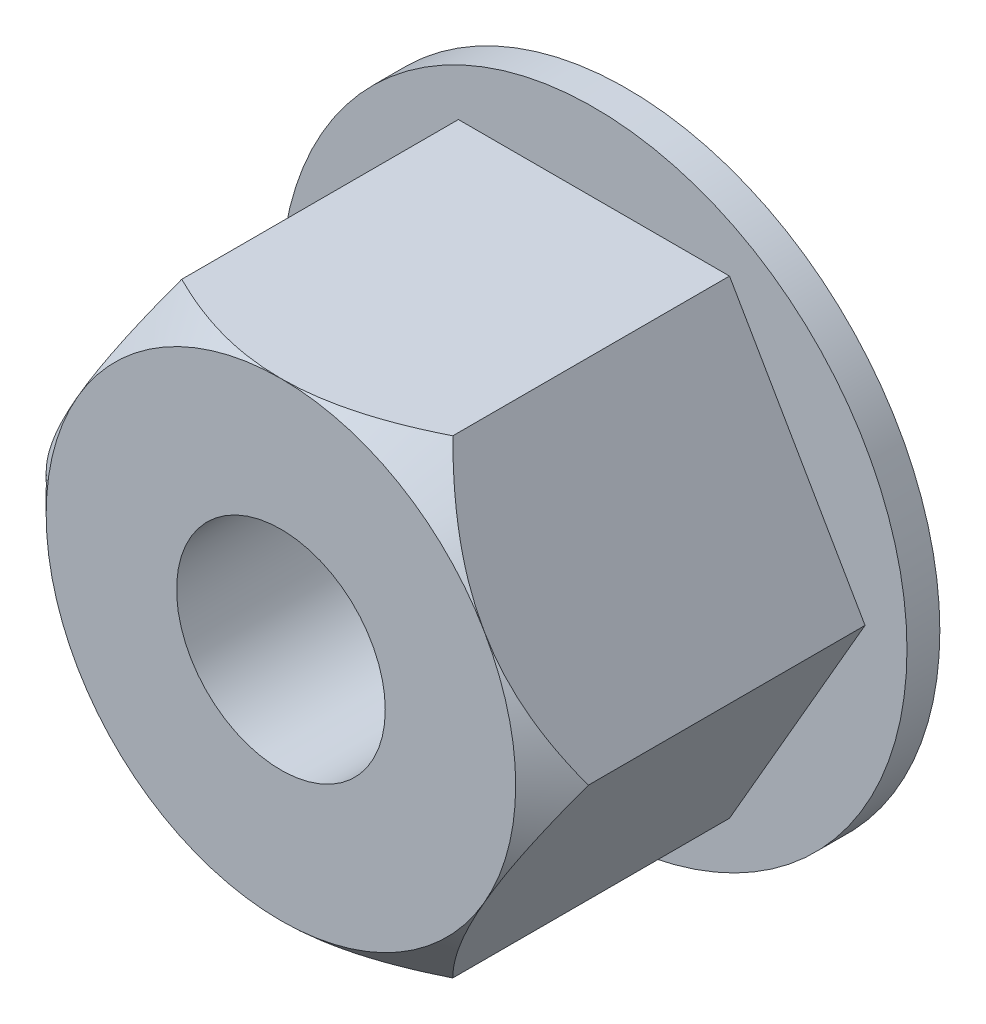
ISO-10303-21;
HEADER;
FILE_DESCRIPTION(('STEP AP214'),'2;1');
FILE_NAME('part.step','',(''),(''),'','','');
FILE_SCHEMA(('AUTOMOTIVE_DESIGN { 1 0 10303 214 1 1 1 1 }'));
ENDSEC;
DATA;
#1=APPLICATION_CONTEXT('core data for automotive mechanical design processes');
#2=APPLICATION_PROTOCOL_DEFINITION('international standard','automotive_design',2000,#1);
#3=PRODUCT_CONTEXT('',#1,'mechanical');
#4=PRODUCT('Part','Part','',(#3));
#5=PRODUCT_RELATED_PRODUCT_CATEGORY('part','',(#4));
#6=PRODUCT_DEFINITION_FORMATION('','',#4);
#7=PRODUCT_DEFINITION_CONTEXT('part definition',#1,'design');
#8=PRODUCT_DEFINITION('design','',#6,#7);
#9=PRODUCT_DEFINITION_SHAPE('','',#8);
#10=(LENGTH_UNIT() NAMED_UNIT(*) SI_UNIT(.MILLI.,.METRE.));
#11=(NAMED_UNIT(*) PLANE_ANGLE_UNIT() SI_UNIT($,.RADIAN.));
#12=(NAMED_UNIT(*) SI_UNIT($,.STERADIAN.) SOLID_ANGLE_UNIT());
#13=UNCERTAINTY_MEASURE_WITH_UNIT(LENGTH_MEASURE(1.E-05),#10,'distance_accuracy_value','');
#14=(GEOMETRIC_REPRESENTATION_CONTEXT(3) GLOBAL_UNCERTAINTY_ASSIGNED_CONTEXT((#13)) GLOBAL_UNIT_ASSIGNED_CONTEXT((#10,
#11,#12)) REPRESENTATION_CONTEXT('',''));
#15=CARTESIAN_POINT('',(0.,0.,0.));
#16=DIRECTION('',(0.,0.,1.));
#17=DIRECTION('',(1.,0.,0.));
#18=AXIS2_PLACEMENT_3D('',#15,#16,#17);
#19=CARTESIAN_POINT('',(-4.1244459855234,-7.14375000000002,10.525));
#20=DIRECTION('',(0.,1.,0.));
#21=DIRECTION('',(-1.,0.,0.));
#22=AXIS2_PLACEMENT_3D('',#19,#20,#21);
#23=PLANE('',#22);
#24=CARTESIAN_POINT('',(-16.7250366044685,-7.14375000000002,-0.518058776784079));
#25=CARTESIAN_POINT('',(-16.4772606232411,-7.14375000000002,-0.290202068247929));
#26=CARTESIAN_POINT('',(-16.2291000095933,-7.14375000000002,-0.0627636921610241));
#27=CARTESIAN_POINT('',(-15.7318969190104,-7.14375000000002,0.391150865365517));
#28=CARTESIAN_POINT('',(-15.4828544351473,-7.14375000000002,0.61762703921507));
#29=CARTESIAN_POINT('',(-14.7341290902898,-7.14375000000002,1.29552003391436));
#30=CARTESIAN_POINT('',(-14.2329594945005,-7.14375000000002,1.74529889980172));
#31=CARTESIAN_POINT('',(-13.2223343051271,-7.14375000000002,2.64182451048178));
#32=CARTESIAN_POINT('',(-12.7128465921656,-7.14375000000002,3.08853512020836));
#33=CARTESIAN_POINT('',(-11.686949833058,-7.14375000000002,3.97383938239323));
#34=CARTESIAN_POINT('',(-11.1705416291098,-7.14375000000002,4.41243400734457));
#35=CARTESIAN_POINT('',(-10.2225431256704,-7.14375000000002,5.19970914844742));
#36=CARTESIAN_POINT('',(-9.79253441656831,-7.14375000000002,5.55028481134301));
#37=CARTESIAN_POINT('',(-9.14103972049585,-7.14375000000002,6.06812401606699));
#38=CARTESIAN_POINT('',(-8.92276245081286,-7.14375000000002,6.23942394288043));
#39=CARTESIAN_POINT('',(-8.48371410990984,-7.14375000000002,6.57879359718683));
#40=CARTESIAN_POINT('',(-8.26294309628304,-7.14375000000002,6.74686339903862));
#41=CARTESIAN_POINT('',(-7.81873153558713,-7.14375000000002,7.07894407832289));
#42=CARTESIAN_POINT('',(-7.59529409899517,-7.14375000000002,7.24295910793026));
#43=CARTESIAN_POINT('',(-7.14503666060728,-7.14375000000002,7.56626753184713));
#44=CARTESIAN_POINT('',(-6.91821683000169,-7.14375000000002,7.72556116390589));
#45=CARTESIAN_POINT('',(-6.46069077173736,-7.14375000000002,8.03828754489159));
#46=CARTESIAN_POINT('',(-6.22998612554177,-7.14375000000002,8.19172259945192));
#47=CARTESIAN_POINT('',(-5.76394688788904,-7.14375000000002,8.4913654457624));
#48=CARTESIAN_POINT('',(-5.52861284405243,-7.14375000000002,8.63757408523746));
#49=CARTESIAN_POINT('',(-5.05473585230229,-7.14375000000002,8.91960187726864));
#50=CARTESIAN_POINT('',(-4.81624328739911,-7.14375000000002,9.0555051944565));
#51=CARTESIAN_POINT('',(-4.3331026551001,-7.14375000000002,9.31605282098714));
#52=CARTESIAN_POINT('',(-4.08845393418546,-7.14375000000002,9.44069592847851));
#53=CARTESIAN_POINT('',(-3.59255053083213,-7.14375000000002,9.67550678093413));
#54=CARTESIAN_POINT('',(-3.34130293794439,-7.14375000000002,9.78568935500066));
#55=CARTESIAN_POINT('',(-2.83154865245522,-7.14375000000002,9.98785379074797));
#56=CARTESIAN_POINT('',(-2.57304408636675,-7.14375000000002,10.0798409219669));
#57=CARTESIAN_POINT('',(-2.10439267228609,-7.14375000000002,10.224087260101));
#58=CARTESIAN_POINT('',(-1.89557304749811,-7.14375000000002,10.2806340143584));
#59=CARTESIAN_POINT('',(-1.47415059126628,-7.14375000000002,10.3773668920018));
#60=CARTESIAN_POINT('',(-1.26154827286381,-7.14375000000002,10.4175552166682));
#61=CARTESIAN_POINT('',(-0.834260083156745,-7.14375000000002,10.4795476845427));
#62=CARTESIAN_POINT('',(-0.619581874776691,-7.14375000000002,10.5014038848691));
#63=CARTESIAN_POINT('',(-0.189118347484976,-7.14375000000002,10.5257274162521));
#64=CARTESIAN_POINT('',(0.0266669344548236,-7.14375000000002,10.5281953906348));
#65=CARTESIAN_POINT('',(0.45773915437624,-7.14375000000002,10.5135952718585));
#66=CARTESIAN_POINT('',(0.673025548824617,-7.14375000000002,10.4965113921098));
#67=CARTESIAN_POINT('',(1.10128730569013,-7.14375000000002,10.4437373997748));
#68=CARTESIAN_POINT('',(1.31426247020931,-7.14375000000002,10.4080457065367));
#69=CARTESIAN_POINT('',(1.73728850926878,-7.14375000000002,10.3197103179283));
#70=CARTESIAN_POINT('',(1.94732865034367,-7.14375000000002,10.2670159133343));
#71=CARTESIAN_POINT('',(2.3631100145607,-7.14375000000002,10.1469276162351));
#72=CARTESIAN_POINT('',(2.56885120657142,-7.14375000000002,10.0795336173213));
#73=CARTESIAN_POINT('',(3.01536837317726,-7.14375000000002,9.91799268441563));
#74=CARTESIAN_POINT('',(3.25517793101231,-7.14375000000002,9.82119186712124));
#75=CARTESIAN_POINT('',(3.72857594973338,-7.14375000000002,9.61330607400458));
#76=CARTESIAN_POINT('',(3.96216143791961,-7.14375000000002,9.50221441523576));
#77=CARTESIAN_POINT('',(4.42395812983921,-7.14375000000002,9.26846158223287));
#78=CARTESIAN_POINT('',(4.65215881551176,-7.14375000000002,9.14577978560599));
#79=CARTESIAN_POINT('',(5.10336871973889,-7.14375000000002,8.8913452550078));
#80=CARTESIAN_POINT('',(5.3263786829134,-7.14375000000002,8.75959383295891));
#81=CARTESIAN_POINT('',(5.77051838497509,-7.14375000000002,8.48719648844859));
#82=CARTESIAN_POINT('',(5.99159462760881,-7.14375000000002,8.34646374765074));
#83=CARTESIAN_POINT('',(6.42978238109183,-7.14375000000002,8.05896655456889));
#84=CARTESIAN_POINT('',(6.64689378801586,-7.14375000000002,7.91220194450585));
#85=CARTESIAN_POINT('',(7.07747046011472,-7.14375000000002,7.61391672475739));
#86=CARTESIAN_POINT('',(7.29093938413418,-7.14375000000002,7.46240138165555));
#87=CARTESIAN_POINT('',(7.71494702830292,-7.14375000000002,7.1553186177003));
#88=CARTESIAN_POINT('',(7.9254856343693,-7.14375000000002,6.99975103975892));
#89=CARTESIAN_POINT('',(8.52049459879557,-7.14375000000002,6.55268170187068));
#90=CARTESIAN_POINT('',(8.9019439207666,-7.14375000000002,6.25715983351294));
#91=CARTESIAN_POINT('',(9.65827357049301,-7.14375000000002,5.65782259108534));
#92=CARTESIAN_POINT('',(10.033153414996,-7.14375000000002,5.35400661106838));
#93=CARTESIAN_POINT('',(10.7780139721135,-7.14375000000002,4.73993293727246));
#94=CARTESIAN_POINT('',(11.1479912031739,-7.14375000000002,4.42967102948342));
#95=CARTESIAN_POINT('',(11.8838630594671,-7.14375000000002,3.80434271833466));
#96=CARTESIAN_POINT('',(12.2497576215634,-7.14375000000002,3.48927624085238));
#97=CARTESIAN_POINT('',(12.9615567346554,-7.14375000000002,2.86990501377884));
#98=CARTESIAN_POINT('',(13.3076085701216,-7.14375000000002,2.56576926669989));
#99=CARTESIAN_POINT('',(13.9972548315126,-7.14375000000002,1.95471884651708));
#100=CARTESIAN_POINT('',(14.3408492284557,-7.14375000000002,1.64780414073591));
#101=CARTESIAN_POINT('',(15.0255243163693,-7.14375000000002,1.03213086255791));
#102=CARTESIAN_POINT('',(15.3666078181235,-7.14375000000002,0.723375412676361));
#103=CARTESIAN_POINT('',(16.047041268799,-7.14375000000002,0.103981075888521));
#104=CARTESIAN_POINT('',(16.3863912722109,-7.14375000000002,-0.206657751136243));
#105=CARTESIAN_POINT('',(16.7250366044685,-7.14375000000002,-0.518058776784081));
#106=B_SPLINE_CURVE_WITH_KNOTS('',3,(#24,#25,#26,#27,#28,#29,#30,#31,#32,#33,#34,#35,#36,#37,
#38,#39,#40,#41,#42,#43,#44,#45,#46,#47,#48,#49,#50,#51,#52,#53,#54,#55,#56,#57,#58,#59,#60,#61,
#62,#63,#64,#65,#66,#67,#68,#69,#70,#71,#72,#73,#74,#75,#76,#77,#78,#79,#80,#81,#82,#83,#84,#85,
#86,#87,#88,#89,#90,#91,#92,#93,#94,#95,#96,#97,#98,#99,#100,#101,#102,#103,#104,#105),
.UNSPECIFIED.,.F.,.F.,(4,2,2,2,2,2,2,2,2,2,2,2,2,2,2,2,2,2,2,2,2,2,2,2,2,2,2,2,2,2,2,2,2,2,2,2,
2,2,2,2,4),(0.,1.00985278778081,2.01971352678839,4.03988845529254,6.07259935665231,
8.10506509147416,9.76934465015488,10.6017256936064,11.4340875522892,12.2655584352629,
13.0969873775597,13.9280856671059,14.7590862286508,15.5823381079753,16.4056777530121,
17.2281663636504,18.0504164254777,18.6988767508964,19.3472497870464,19.9937753660695,
20.6402794924568,21.2873059887437,21.9343874560389,22.5834169117916,23.2324510659489,
24.0076854473988,24.7832836851578,25.5602889171264,26.337181990413,27.1232703975962,
27.9093793800428,28.6946457323468,29.4799425715375,30.9273593771971,32.3748822120078,
33.8233831517974,35.2719064610067,36.654007954276,38.0361257206082,39.4163395084831,
40.7965096405426),.UNSPECIFIED.);
#107=CARTESIAN_POINT('',(-4.1244459855234,-7.14375000000002,9.41985802895322));
#108=VERTEX_POINT('',#107);
#109=CARTESIAN_POINT('',(0.,-7.14375000000002,10.525));
#110=VERTEX_POINT('',#109);
#111=EDGE_CURVE('E256',#108,#110,#106,.T.);
#112=ORIENTED_EDGE('',*,*,#111,.F.);
#113=DIRECTION('',(0.,0.,-1.));
#114=VECTOR('',#113,1.);
#115=CARTESIAN_POINT('',(-4.1244459855234,-7.14375000000002,10.525));
#116=LINE('',#115,#114);
#117=CARTESIAN_POINT('',(-4.1244459855234,-7.14375000000002,1.));
#118=VERTEX_POINT('',#117);
#119=EDGE_CURVE('E235',#108,#118,#116,.T.);
#120=ORIENTED_EDGE('',*,*,#119,.T.);
#121=DIRECTION('',(1.,0.,0.));
#122=VECTOR('',#121,1.);
#123=CARTESIAN_POINT('',(-4.1244459855234,-7.14375000000002,1.));
#124=LINE('',#123,#122);
#125=CARTESIAN_POINT('',(4.1244459855234,-7.14375000000002,1.));
#126=VERTEX_POINT('',#125);
#127=EDGE_CURVE('E251',#118,#126,#124,.T.);
#128=ORIENTED_EDGE('',*,*,#127,.T.);
#129=DIRECTION('',(0.,0.,-1.));
#130=VECTOR('',#129,1.);
#131=CARTESIAN_POINT('',(4.1244459855234,-7.14375000000002,10.525));
#132=LINE('',#131,#130);
#133=CARTESIAN_POINT('',(4.1244459855234,-7.14375000000002,9.41985802895322));
#134=VERTEX_POINT('',#133);
#135=EDGE_CURVE('E223',#134,#126,#132,.T.);
#136=ORIENTED_EDGE('',*,*,#135,.F.);
#137=EDGE_CURVE('E163',#110,#134,#106,.T.);
#138=ORIENTED_EDGE('',*,*,#137,.F.);
#139=EDGE_LOOP('',(#112,#120,#128,#136,#138));
#140=FACE_BOUND('',#139,.T.);
#141=ADVANCED_FACE('F34',(#140),#23,.F.);
#142=CARTESIAN_POINT('',(4.1244459855234,-7.14375000000002,10.525));
#143=DIRECTION('',(-0.866025403784439,0.5,0.));
#144=DIRECTION('',(-0.5,-0.866025403784439,0.));
#145=AXIS2_PLACEMENT_3D('',#142,#143,#144);
#146=PLANE('',#145);
#147=CARTESIAN_POINT('',(4.12433051546956,-7.14395000000002,9.41974255647485));
#148=CARTESIAN_POINT('',(4.19524703068089,-7.02111899255827,9.49065140521226));
#149=CARTESIAN_POINT('',(4.26670864124882,-6.89734385226391,9.55938414906155));
#150=CARTESIAN_POINT('',(4.41082898954811,-6.64772008660503,9.69183547302003));
#151=CARTESIAN_POINT('',(4.48348835526277,-6.5218703735415,9.75555131465574));
#152=CARTESIAN_POINT('',(4.70409848523477,-6.13976241976563,9.93872387688273));
#153=CARTESIAN_POINT('',(4.8539168024438,-5.88026948245511,10.0494242385606));
#154=CARTESIAN_POINT('',(5.15603740421412,-5.35698125017564,10.2389908902059));
#155=CARTESIAN_POINT('',(5.30826247233014,-5.09331969801306,10.3183347530669));
#156=CARTESIAN_POINT('',(5.5391026566828,-4.69349277028567,10.410116042587));
#157=CARTESIAN_POINT('',(5.61638923819207,-4.55962848436831,10.4361584480344));
#158=CARTESIAN_POINT('',(5.77161677972581,-4.29076649569787,10.4785757851785));
#159=CARTESIAN_POINT('',(5.84955764019293,-4.15576896538318,10.4949521615859));
#160=CARTESIAN_POINT('',(6.03948971703997,-3.82679695829702,10.5224096033269));
#161=CARTESIAN_POINT('',(6.15168557899214,-3.63246802499689,10.5281705840301));
#162=CARTESIAN_POINT('',(6.37587507682164,-3.24416042423284,10.5185003713287));
#163=CARTESIAN_POINT('',(6.48786862803521,-3.05018190341086,10.5030617493423));
#164=CARTESIAN_POINT('',(6.71079986264652,-2.66405367847001,10.45190237942));
#165=CARTESIAN_POINT('',(6.82173622400645,-2.4719062641878,10.4161589506573));
#166=CARTESIAN_POINT('',(7.04170221777466,-2.09091398704387,10.3263332014951));
#167=CARTESIAN_POINT('',(7.15073199571878,-1.90206887210671,10.2722522873392));
#168=CARTESIAN_POINT('',(7.34427751378539,-1.5668382012381,10.1609923795056));
#169=CARTESIAN_POINT('',(7.42922185909046,-1.41971027935405,10.106739720237));
#170=CARTESIAN_POINT('',(7.59758573237026,-1.12809549667434,9.98949193812102));
#171=CARTESIAN_POINT('',(7.68100521405416,-0.983608716056775,9.92649655036449));
#172=CARTESIAN_POINT('',(7.84605661423444,-0.697731305084146,9.79317539151497));
#173=CARTESIAN_POINT('',(7.92769322684404,-0.556332544286503,9.72287267314928));
#174=CARTESIAN_POINT('',(8.08945480371848,-0.276153274427508,9.57585980698289));
#175=CARTESIAN_POINT('',(8.16958065852105,-0.137371222909573,9.49915358839838));
#176=CARTESIAN_POINT('',(8.24900744110064,0.000200000000002508,9.41974255647485));
#177=B_SPLINE_CURVE_WITH_KNOTS('',3,(#147,#148,#149,#150,#151,#152,#153,#154,#155,#156,#157,
#158,#159,#160,#161,#162,#163,#164,#165,#166,#167,#168,#169,#170,#171,#172,#173,#174,#175,#176),
.UNSPECIFIED.,.F.,.F.,(4,2,2,2,2,2,2,2,2,2,2,2,2,2,4),(0.,0.475684325958298,0.951626529425497,
1.90864918232101,2.85047554454488,3.32046508385128,3.79038435945424,4.46273505597872,
5.13532141197003,5.80866054023088,6.48194804392428,7.01672008678781,7.55150833705006,
8.0846579250057,8.61748274129551),.UNSPECIFIED.);
#178=CARTESIAN_POINT('',(6.1866689782851,-3.57187500000001,10.525));
#179=VERTEX_POINT('',#178);
#180=EDGE_CURVE('E260',#134,#179,#177,.T.);
#181=ORIENTED_EDGE('',*,*,#180,.F.);
#182=ORIENTED_EDGE('',*,*,#135,.T.);
#183=DIRECTION('',(0.5,0.866025403784439,0.));
#184=VECTOR('',#183,1.);
#185=CARTESIAN_POINT('',(4.1244459855234,-7.14375000000002,1.));
#186=LINE('',#185,#184);
#187=CARTESIAN_POINT('',(8.2488919710468,0.,1.));
#188=VERTEX_POINT('',#187);
#189=EDGE_CURVE('E248',#126,#188,#186,.T.);
#190=ORIENTED_EDGE('',*,*,#189,.T.);
#191=DIRECTION('',(0.,0.,-1.));
#192=VECTOR('',#191,1.);
#193=CARTESIAN_POINT('',(8.2488919710468,0.,10.525));
#194=LINE('',#193,#192);
#195=CARTESIAN_POINT('',(8.2488919710468,0.,9.41985802895322));
#196=VERTEX_POINT('',#195);
#197=EDGE_CURVE('E226',#196,#188,#194,.T.);
#198=ORIENTED_EDGE('',*,*,#197,.F.);
#199=EDGE_CURVE('E264',#179,#196,#177,.T.);
#200=ORIENTED_EDGE('',*,*,#199,.F.);
#201=EDGE_LOOP('',(#181,#182,#190,#198,#200));
#202=FACE_BOUND('',#201,.T.);
#203=ADVANCED_FACE('F192',(#202),#146,.F.);
#204=CARTESIAN_POINT('',(8.2488919710468,0.,10.525));
#205=DIRECTION('',(-0.866025403784439,-0.5,0.));
#206=DIRECTION('',(0.5,-0.866025403784439,0.));
#207=AXIS2_PLACEMENT_3D('',#204,#205,#206);
#208=PLANE('',#207);
#209=CARTESIAN_POINT('',(8.24900744110064,-0.000199999999998024,9.41974255647485));
#210=CARTESIAN_POINT('',(8.17809092588931,0.122631007441758,9.49065140521226));
#211=CARTESIAN_POINT('',(8.10662931532138,0.246406147736113,9.55938414906155));
#212=CARTESIAN_POINT('',(7.96250896702209,0.496029913394996,9.69183547302003));
#213=CARTESIAN_POINT('',(7.88984960130743,0.621879626458519,9.75555131465574));
#214=CARTESIAN_POINT('',(7.66923947133544,1.00398758023439,9.93872387688273));
#215=CARTESIAN_POINT('',(7.5194211541264,1.26348051754491,10.0494242385606));
#216=CARTESIAN_POINT('',(7.21730055235608,1.78676874982438,10.2389908902059));
#217=CARTESIAN_POINT('',(7.06507548424006,2.05043030198696,10.3183347530669));
#218=CARTESIAN_POINT('',(6.8342352998874,2.45025722971434,10.410116042587));
#219=CARTESIAN_POINT('',(6.75694871837813,2.5841215156317,10.4361584480344));
#220=CARTESIAN_POINT('',(6.6017211768444,2.85298350430215,10.4785757851785));
#221=CARTESIAN_POINT('',(6.52378031637727,2.98798103461684,10.4949521615859));
#222=CARTESIAN_POINT('',(6.33384823953023,3.316953041703,10.5224096033269));
#223=CARTESIAN_POINT('',(6.22165237757806,3.51128197500313,10.52817058403));
#224=CARTESIAN_POINT('',(5.99746287974856,3.89958957576718,10.5185003713287));
#225=CARTESIAN_POINT('',(5.88546932853499,4.09356809658916,10.5030617493423));
#226=CARTESIAN_POINT('',(5.66253809392368,4.47969632153,10.45190237942));
#227=CARTESIAN_POINT('',(5.55160173256375,4.67184373581222,10.4161589506573));
#228=CARTESIAN_POINT('',(5.33163573879554,5.05283601295614,10.3263332014951));
#229=CARTESIAN_POINT('',(5.22260596085142,5.2416811278933,10.2722522873392));
#230=CARTESIAN_POINT('',(5.02906044278481,5.57691179876192,10.1609923795056));
#231=CARTESIAN_POINT('',(4.94411609747974,5.72403972064597,10.106739720237));
#232=CARTESIAN_POINT('',(4.77575222419994,6.01565450332567,9.98949193812102));
#233=CARTESIAN_POINT('',(4.69233274251604,6.16014128394324,9.92649655036449));
#234=CARTESIAN_POINT('',(4.52728134233576,6.44601869491587,9.79317539151497));
#235=CARTESIAN_POINT('',(4.44564472972616,6.58741745571352,9.72287267314928));
#236=CARTESIAN_POINT('',(4.28388315285172,6.86759672557251,9.57585980698289));
#237=CARTESIAN_POINT('',(4.20375729804915,7.00637877709045,9.49915358839838));
#238=CARTESIAN_POINT('',(4.12433051546956,7.14395000000002,9.41974255647485));
#239=B_SPLINE_CURVE_WITH_KNOTS('',3,(#209,#210,#211,#212,#213,#214,#215,#216,#217,#218,#219,
#220,#221,#222,#223,#224,#225,#226,#227,#228,#229,#230,#231,#232,#233,#234,#235,#236,#237,#238),
.UNSPECIFIED.,.F.,.F.,(4,2,2,2,2,2,2,2,2,2,2,2,2,2,4),(0.,0.475684325958296,0.951626529425495,
1.908649182321,2.85047554454488,3.32046508385127,3.79038435945423,4.46273505597871,
5.13532141197002,5.80866054023087,6.48194804392427,7.01672008678781,7.55150833705005,
8.0846579250057,8.61748274129551),.UNSPECIFIED.);
#240=CARTESIAN_POINT('',(6.1866689782851,3.57187500000001,10.525));
#241=VERTEX_POINT('',#240);
#242=EDGE_CURVE('E265',#196,#241,#239,.T.);
#243=ORIENTED_EDGE('',*,*,#242,.F.);
#244=ORIENTED_EDGE('',*,*,#197,.T.);
#245=DIRECTION('',(-0.5,0.866025403784439,0.));
#246=VECTOR('',#245,1.);
#247=CARTESIAN_POINT('',(8.2488919710468,0.,1.));
#248=LINE('',#247,#246);
#249=CARTESIAN_POINT('',(4.1244459855234,7.14375000000002,1.));
#250=VERTEX_POINT('',#249);
#251=EDGE_CURVE('E245',#188,#250,#248,.T.);
#252=ORIENTED_EDGE('',*,*,#251,.T.);
#253=DIRECTION('',(0.,0.,-1.));
#254=VECTOR('',#253,1.);
#255=CARTESIAN_POINT('',(4.1244459855234,7.14375000000002,10.525));
#256=LINE('',#255,#254);
#257=CARTESIAN_POINT('',(4.1244459855234,7.14375000000002,9.41985802895322));
#258=VERTEX_POINT('',#257);
#259=EDGE_CURVE('E230',#258,#250,#256,.T.);
#260=ORIENTED_EDGE('',*,*,#259,.F.);
#261=EDGE_CURVE('E108',#241,#258,#239,.T.);
#262=ORIENTED_EDGE('',*,*,#261,.F.);
#263=EDGE_LOOP('',(#243,#244,#252,#260,#262));
#264=FACE_BOUND('',#263,.T.);
#265=ADVANCED_FACE('F190',(#264),#208,.F.);
#266=CARTESIAN_POINT('',(4.1244459855234,7.14375000000002,10.525));
#267=DIRECTION('',(0.,-1.,0.));
#268=DIRECTION('',(0.,0.,-1.));
#269=AXIS2_PLACEMENT_3D('',#266,#267,#268);
#270=PLANE('',#269);
#271=CARTESIAN_POINT('',(16.7250366044685,7.14375000000002,-0.518058776784071));
#272=CARTESIAN_POINT('',(16.4772606232411,7.14375000000002,-0.290202068247922));
#273=CARTESIAN_POINT('',(16.2291000095932,7.14375000000002,-0.0627636921610171));
#274=CARTESIAN_POINT('',(15.7318969190104,7.14375000000002,0.391150865365523));
#275=CARTESIAN_POINT('',(15.4828544351473,7.14375000000002,0.617627039215076));
#276=CARTESIAN_POINT('',(14.7341290902898,7.14375000000002,1.29552003391437));
#277=CARTESIAN_POINT('',(14.2329594945005,7.14375000000002,1.74529889980173));
#278=CARTESIAN_POINT('',(13.2223343051271,7.14375000000002,2.64182451048178));
#279=CARTESIAN_POINT('',(12.7128465921656,7.14375000000002,3.08853512020836));
#280=CARTESIAN_POINT('',(11.686949833058,7.14375000000002,3.97383938239323));
#281=CARTESIAN_POINT('',(11.1705416291098,7.14375000000002,4.41243400734457));
#282=CARTESIAN_POINT('',(10.2225431256704,7.14375000000002,5.19970914844742));
#283=CARTESIAN_POINT('',(9.79253441656831,7.14375000000002,5.55028481134301));
#284=CARTESIAN_POINT('',(9.14103972049585,7.14375000000002,6.06812401606699));
#285=CARTESIAN_POINT('',(8.92276245081286,7.14375000000002,6.23942394288043));
#286=CARTESIAN_POINT('',(8.48371410990984,7.14375000000002,6.57879359718683));
#287=CARTESIAN_POINT('',(8.26294309628304,7.14375000000002,6.74686339903862));
#288=CARTESIAN_POINT('',(7.81873153558714,7.14375000000002,7.07894407832288));
#289=CARTESIAN_POINT('',(7.59529409899517,7.14375000000002,7.24295910793026));
#290=CARTESIAN_POINT('',(7.14503666060729,7.14375000000002,7.56626753184712));
#291=CARTESIAN_POINT('',(6.9182168300017,7.14375000000002,7.72556116390588));
#292=CARTESIAN_POINT('',(6.46069077173737,7.14375000000002,8.03828754489158));
#293=CARTESIAN_POINT('',(6.22998612554179,7.14375000000002,8.19172259945191));
#294=CARTESIAN_POINT('',(5.76394688788906,7.14375000000002,8.49136544576239));
#295=CARTESIAN_POINT('',(5.52861284405245,7.14375000000002,8.63757408523744));
#296=CARTESIAN_POINT('',(5.0547358523023,7.14375000000002,8.91960187726863));
#297=CARTESIAN_POINT('',(4.81624328739912,7.14375000000002,9.05550519445649));
#298=CARTESIAN_POINT('',(4.33310265510011,7.14375000000002,9.31605282098713));
#299=CARTESIAN_POINT('',(4.08845393418548,7.14375000000002,9.4406959284785));
#300=CARTESIAN_POINT('',(3.59255053083215,7.14375000000002,9.67550678093412));
#301=CARTESIAN_POINT('',(3.3413029379444,7.14375000000002,9.78568935500065));
#302=CARTESIAN_POINT('',(2.83154865245523,7.14375000000002,9.98785379074796));
#303=CARTESIAN_POINT('',(2.57304408636676,7.14375000000002,10.0798409219669));
#304=CARTESIAN_POINT('',(2.1043926722861,7.14375000000002,10.224087260101));
#305=CARTESIAN_POINT('',(1.89557304749812,7.14375000000002,10.2806340143584));
#306=CARTESIAN_POINT('',(1.47415059126629,7.14375000000002,10.3773668920018));
#307=CARTESIAN_POINT('',(1.26154827286382,7.14375000000002,10.4175552166682));
#308=CARTESIAN_POINT('',(0.834260083156751,7.14375000000002,10.4795476845427));
#309=CARTESIAN_POINT('',(0.619581874776695,7.14375000000002,10.5014038848691));
#310=CARTESIAN_POINT('',(0.189118347484981,7.14375000000002,10.5257274162521));
#311=CARTESIAN_POINT('',(-0.0266669344548175,7.14375000000002,10.5281953906348));
#312=CARTESIAN_POINT('',(-0.457739154376234,7.14375000000002,10.5135952718585));
#313=CARTESIAN_POINT('',(-0.673025548824612,7.14375000000002,10.4965113921098));
#314=CARTESIAN_POINT('',(-1.10128730569012,7.14375000000002,10.4437373997748));
#315=CARTESIAN_POINT('',(-1.31426247020931,7.14375000000002,10.4080457065367));
#316=CARTESIAN_POINT('',(-1.73728850926877,7.14375000000002,10.3197103179283));
#317=CARTESIAN_POINT('',(-1.94732865034367,7.14375000000002,10.2670159133343));
#318=CARTESIAN_POINT('',(-2.36311001456069,7.14375000000002,10.1469276162351));
#319=CARTESIAN_POINT('',(-2.56885120657142,7.14375000000002,10.0795336173213));
#320=CARTESIAN_POINT('',(-3.01536837317726,7.14375000000002,9.91799268441563));
#321=CARTESIAN_POINT('',(-3.2551779310123,7.14375000000002,9.82119186712124));
#322=CARTESIAN_POINT('',(-3.72857594973338,7.14375000000002,9.61330607400459));
#323=CARTESIAN_POINT('',(-3.96216143791961,7.14375000000002,9.50221441523576));
#324=CARTESIAN_POINT('',(-4.42395812983921,7.14375000000002,9.26846158223287));
#325=CARTESIAN_POINT('',(-4.65215881551176,7.14375000000002,9.14577978560599));
#326=CARTESIAN_POINT('',(-5.10336871973889,7.14375000000002,8.8913452550078));
#327=CARTESIAN_POINT('',(-5.32637868291339,7.14375000000002,8.75959383295891));
#328=CARTESIAN_POINT('',(-5.77051838497509,7.14375000000002,8.48719648844859));
#329=CARTESIAN_POINT('',(-5.9915946276088,7.14375000000002,8.34646374765075));
#330=CARTESIAN_POINT('',(-6.42978238109183,7.14375000000002,8.0589665545689));
#331=CARTESIAN_POINT('',(-6.64689378801585,7.14375000000002,7.91220194450586));
#332=CARTESIAN_POINT('',(-7.07747046011472,7.14375000000002,7.6139167247574));
#333=CARTESIAN_POINT('',(-7.29093938413418,7.14375000000002,7.46240138165555));
#334=CARTESIAN_POINT('',(-7.71494702830291,7.14375000000002,7.1553186177003));
#335=CARTESIAN_POINT('',(-7.92548563436929,7.14375000000002,6.99975103975893));
#336=CARTESIAN_POINT('',(-8.52049459879556,7.14375000000002,6.55268170187068));
#337=CARTESIAN_POINT('',(-8.90194392076659,7.14375000000002,6.25715983351294));
#338=CARTESIAN_POINT('',(-9.658273570493,7.14375000000002,5.65782259108535));
#339=CARTESIAN_POINT('',(-10.033153414996,7.14375000000002,5.35400661106839));
#340=CARTESIAN_POINT('',(-10.7780139721135,7.14375000000002,4.73993293727247));
#341=CARTESIAN_POINT('',(-11.1479912031739,7.14375000000002,4.42967102948343));
#342=CARTESIAN_POINT('',(-11.8838630594671,7.14375000000002,3.80434271833467));
#343=CARTESIAN_POINT('',(-12.2497576215634,7.14375000000002,3.48927624085239));
#344=CARTESIAN_POINT('',(-12.9615567346554,7.14375000000002,2.86990501377885));
#345=CARTESIAN_POINT('',(-13.3076085701216,7.14375000000002,2.56576926669989));
#346=CARTESIAN_POINT('',(-13.9972548315126,7.14375000000002,1.95471884651708));
#347=CARTESIAN_POINT('',(-14.3408492284557,7.14375000000002,1.64780414073591));
#348=CARTESIAN_POINT('',(-15.0255243163693,7.14375000000002,1.03213086255791));
#349=CARTESIAN_POINT('',(-15.3666078181235,7.14375000000002,0.723375412676363));
#350=CARTESIAN_POINT('',(-16.047041268799,7.14375000000002,0.103981075888522));
#351=CARTESIAN_POINT('',(-16.3863912722109,7.14375000000002,-0.206657751136242));
#352=CARTESIAN_POINT('',(-16.7250366044685,7.14375000000002,-0.518058776784076));
#353=B_SPLINE_CURVE_WITH_KNOTS('',3,(#271,#272,#273,#274,#275,#276,#277,#278,#279,#280,#281,
#282,#283,#284,#285,#286,#287,#288,#289,#290,#291,#292,#293,#294,#295,#296,#297,#298,#299,#300,
#301,#302,#303,#304,#305,#306,#307,#308,#309,#310,#311,#312,#313,#314,#315,#316,#317,#318,#319,
#320,#321,#322,#323,#324,#325,#326,#327,#328,#329,#330,#331,#332,#333,#334,#335,#336,#337,#338,
#339,#340,#341,#342,#343,#344,#345,#346,#347,#348,#349,#350,#351,#352),.UNSPECIFIED.,.F.,.F.,(4,
2,2,2,2,2,2,2,2,2,2,2,2,2,2,2,2,2,2,2,2,2,2,2,2,2,2,2,2,2,2,2,2,2,2,2,2,2,2,2,4),(0.,
1.00985278778081,2.01971352678839,4.03988845529253,6.07259935665231,8.10506509147416,
9.76934465015487,10.6017256936064,11.4340875522892,12.2655584352629,13.0969873775597,
13.9280856671059,14.7590862286507,15.5823381079753,16.4056777530121,17.2281663636504,
18.0504164254777,18.6988767508963,19.3472497870464,19.9937753660695,20.6402794924568,
21.2873059887437,21.9343874560389,22.5834169117916,23.2324510659489,24.0076854473988,
24.7832836851578,25.5602889171264,26.337181990413,27.1232703975962,27.9093793800427,
28.6946457323468,29.4799425715375,30.927359377197,32.3748822120078,33.8233831517974,
35.2719064610067,36.654007954276,38.0361257206082,39.4163395084831,40.7965096405425),.UNSPECIFIED.);
#354=CARTESIAN_POINT('',(0.,7.14375000000002,10.525));
#355=VERTEX_POINT('',#354);
#356=EDGE_CURVE('E104',#258,#355,#353,.T.);
#357=ORIENTED_EDGE('',*,*,#356,.F.);
#358=ORIENTED_EDGE('',*,*,#259,.T.);
#359=DIRECTION('',(-1.,0.,0.));
#360=VECTOR('',#359,1.);
#361=CARTESIAN_POINT('',(4.1244459855234,7.14375000000002,1.));
#362=LINE('',#361,#360);
#363=CARTESIAN_POINT('',(-4.1244459855234,7.14375000000002,1.));
#364=VERTEX_POINT('',#363);
#365=EDGE_CURVE('E243',#250,#364,#362,.T.);
#366=ORIENTED_EDGE('',*,*,#365,.T.);
#367=DIRECTION('',(0.,0.,-1.));
#368=VECTOR('',#367,1.);
#369=CARTESIAN_POINT('',(-4.1244459855234,7.14375000000002,10.525));
#370=LINE('',#369,#368);
#371=CARTESIAN_POINT('',(-4.1244459855234,7.14375000000002,9.41985802895322));
#372=VERTEX_POINT('',#371);
#373=EDGE_CURVE('E128',#372,#364,#370,.T.);
#374=ORIENTED_EDGE('',*,*,#373,.F.);
#375=EDGE_CURVE('E112',#355,#372,#353,.T.);
#376=ORIENTED_EDGE('',*,*,#375,.F.);
#377=EDGE_LOOP('',(#357,#358,#366,#374,#376));
#378=FACE_BOUND('',#377,.T.);
#379=ADVANCED_FACE('F126',(#378),#270,.F.);
#380=CARTESIAN_POINT('',(-4.1244459855234,7.14375000000002,10.525));
#381=DIRECTION('',(0.866025403784439,-0.5,0.));
#382=DIRECTION('',(0.5,0.866025403784439,0.));
#383=AXIS2_PLACEMENT_3D('',#380,#381,#382);
#384=PLANE('',#383);
#385=CARTESIAN_POINT('',(-4.12433051546956,7.14395000000002,9.41974255647485));
#386=CARTESIAN_POINT('',(-4.19524703068089,7.02111899255827,9.49065140521226));
#387=CARTESIAN_POINT('',(-4.26670864124882,6.89734385226391,9.55938414906155));
#388=CARTESIAN_POINT('',(-4.41082898954811,6.64772008660503,9.69183547302003));
#389=CARTESIAN_POINT('',(-4.48348835526277,6.5218703735415,9.75555131465574));
#390=CARTESIAN_POINT('',(-4.70409848523477,6.13976241976563,9.93872387688273));
#391=CARTESIAN_POINT('',(-4.8539168024438,5.88026948245511,10.0494242385606));
#392=CARTESIAN_POINT('',(-5.15603740421412,5.35698125017564,10.2389908902059));
#393=CARTESIAN_POINT('',(-5.30826247233014,5.09331969801306,10.3183347530669));
#394=CARTESIAN_POINT('',(-5.5391026566828,4.69349277028568,10.410116042587));
#395=CARTESIAN_POINT('',(-5.61638923819207,4.55962848436832,10.4361584480344));
#396=CARTESIAN_POINT('',(-5.77161677972581,4.29076649569788,10.4785757851785));
#397=CARTESIAN_POINT('',(-5.84955764019293,4.15576896538318,10.4949521615859));
#398=CARTESIAN_POINT('',(-6.03948971703997,3.82679695829703,10.5224096033269));
#399=CARTESIAN_POINT('',(-6.15168557899214,3.63246802499689,10.52817058403));
#400=CARTESIAN_POINT('',(-6.37587507682164,3.24416042423285,10.5185003713287));
#401=CARTESIAN_POINT('',(-6.48786862803521,3.05018190341087,10.5030617493423));
#402=CARTESIAN_POINT('',(-6.71079986264652,2.66405367847002,10.45190237942));
#403=CARTESIAN_POINT('',(-6.82173622400645,2.47190626418781,10.4161589506573));
#404=CARTESIAN_POINT('',(-7.04170221777466,2.09091398704388,10.3263332014951));
#405=CARTESIAN_POINT('',(-7.15073199571878,1.90206887210672,10.2722522873392));
#406=CARTESIAN_POINT('',(-7.34427751378539,1.5668382012381,10.1609923795056));
#407=CARTESIAN_POINT('',(-7.42922185909046,1.41971027935405,10.106739720237));
#408=CARTESIAN_POINT('',(-7.59758573237026,1.12809549667435,9.98949193812102));
#409=CARTESIAN_POINT('',(-7.68100521405416,0.983608716056778,9.92649655036449));
#410=CARTESIAN_POINT('',(-7.84605661423444,0.69773130508415,9.79317539151497));
#411=CARTESIAN_POINT('',(-7.92769322684404,0.556332544286507,9.72287267314928));
#412=CARTESIAN_POINT('',(-8.08945480371848,0.276153274427511,9.57585980698288));
#413=CARTESIAN_POINT('',(-8.16958065852105,0.137371222909575,9.49915358839837));
#414=CARTESIAN_POINT('',(-8.24900744110064,-0.000200000000000251,9.41974255647485));
#415=B_SPLINE_CURVE_WITH_KNOTS('',3,(#385,#386,#387,#388,#389,#390,#391,#392,#393,#394,#395,
#396,#397,#398,#399,#400,#401,#402,#403,#404,#405,#406,#407,#408,#409,#410,#411,#412,#413,#414),
.UNSPECIFIED.,.F.,.F.,(4,2,2,2,2,2,2,2,2,2,2,2,2,2,4),(0.,0.475684325958297,0.951626529425498,
1.908649182321,2.85047554454488,3.32046508385127,3.79038435945423,4.46273505597872,
5.13532141197002,5.80866054023087,6.48194804392427,7.01672008678781,7.55150833705006,
8.0846579250057,8.61748274129551),.UNSPECIFIED.);
#416=CARTESIAN_POINT('',(-6.1866689782851,3.57187500000001,10.525));
#417=VERTEX_POINT('',#416);
#418=EDGE_CURVE('E117',#372,#417,#415,.T.);
#419=ORIENTED_EDGE('',*,*,#418,.F.);
#420=ORIENTED_EDGE('',*,*,#373,.T.);
#421=DIRECTION('',(-0.5,-0.866025403784439,0.));
#422=VECTOR('',#421,1.);
#423=CARTESIAN_POINT('',(-4.1244459855234,7.14375000000002,1.));
#424=LINE('',#423,#422);
#425=CARTESIAN_POINT('',(-8.2488919710468,0.,1.));
#426=VERTEX_POINT('',#425);
#427=EDGE_CURVE('E240',#364,#426,#424,.T.);
#428=ORIENTED_EDGE('',*,*,#427,.T.);
#429=DIRECTION('',(0.,0.,-1.));
#430=VECTOR('',#429,1.);
#431=CARTESIAN_POINT('',(-8.2488919710468,0.,10.525));
#432=LINE('',#431,#430);
#433=CARTESIAN_POINT('',(-8.2488919710468,0.,9.41985802895322));
#434=VERTEX_POINT('',#433);
#435=EDGE_CURVE('E233',#434,#426,#432,.T.);
#436=ORIENTED_EDGE('',*,*,#435,.F.);
#437=EDGE_CURVE('E129',#417,#434,#415,.T.);
#438=ORIENTED_EDGE('',*,*,#437,.F.);
#439=EDGE_LOOP('',(#419,#420,#428,#436,#438));
#440=FACE_BOUND('',#439,.T.);
#441=ADVANCED_FACE('F182',(#440),#384,.F.);
#442=CARTESIAN_POINT('',(-8.2488919710468,0.,10.525));
#443=DIRECTION('',(0.866025403784439,0.5,0.));
#444=DIRECTION('',(-0.5,0.866025403784439,0.));
#445=AXIS2_PLACEMENT_3D('',#442,#443,#444);
#446=PLANE('',#445);
#447=CARTESIAN_POINT('',(-8.24900744110064,0.000200000000000187,9.41974255647485));
#448=CARTESIAN_POINT('',(-8.17809092588931,-0.122631007441756,9.49065140521226));
#449=CARTESIAN_POINT('',(-8.10662931532138,-0.246406147736111,9.55938414906155));
#450=CARTESIAN_POINT('',(-7.9625089670221,-0.496029913394993,9.69183547302003));
#451=CARTESIAN_POINT('',(-7.88984960130743,-0.621879626458516,9.75555131465574));
#452=CARTESIAN_POINT('',(-7.66923947133544,-1.00398758023439,9.93872387688273));
#453=CARTESIAN_POINT('',(-7.5194211541264,-1.26348051754491,10.0494242385606));
#454=CARTESIAN_POINT('',(-7.21730055235609,-1.78676874982438,10.2389908902059));
#455=CARTESIAN_POINT('',(-7.06507548424007,-2.05043030198696,10.3183347530669));
#456=CARTESIAN_POINT('',(-6.8342352998874,-2.45025722971434,10.410116042587));
#457=CARTESIAN_POINT('',(-6.75694871837814,-2.5841215156317,10.4361584480344));
#458=CARTESIAN_POINT('',(-6.6017211768444,-2.85298350430214,10.4785757851785));
#459=CARTESIAN_POINT('',(-6.52378031637727,-2.98798103461684,10.4949521615859));
#460=CARTESIAN_POINT('',(-6.33384823953023,-3.31695304170299,10.5224096033269));
#461=CARTESIAN_POINT('',(-6.22165237757807,-3.51128197500313,10.52817058403));
#462=CARTESIAN_POINT('',(-5.99746287974857,-3.89958957576717,10.5185003713287));
#463=CARTESIAN_POINT('',(-5.88546932853499,-4.09356809658915,10.5030617493423));
#464=CARTESIAN_POINT('',(-5.66253809392368,-4.47969632153,10.45190237942));
#465=CARTESIAN_POINT('',(-5.55160173256376,-4.67184373581221,10.4161589506573));
#466=CARTESIAN_POINT('',(-5.33163573879554,-5.05283601295614,10.3263332014951));
#467=CARTESIAN_POINT('',(-5.22260596085143,-5.2416811278933,10.2722522873392));
#468=CARTESIAN_POINT('',(-5.02906044278481,-5.57691179876191,10.1609923795056));
#469=CARTESIAN_POINT('',(-4.94411609747974,-5.72403972064596,10.106739720237));
#470=CARTESIAN_POINT('',(-4.77575222419994,-6.01565450332567,9.98949193812102));
#471=CARTESIAN_POINT('',(-4.69233274251605,-6.16014128394324,9.92649655036449));
#472=CARTESIAN_POINT('',(-4.52728134233577,-6.44601869491587,9.79317539151497));
#473=CARTESIAN_POINT('',(-4.44564472972617,-6.58741745571351,9.72287267314928));
#474=CARTESIAN_POINT('',(-4.28388315285172,-6.86759672557251,9.57585980698288));
#475=CARTESIAN_POINT('',(-4.20375729804915,-7.00637877709045,9.49915358839837));
#476=CARTESIAN_POINT('',(-4.12433051546956,-7.14395000000002,9.41974255647485));
#477=B_SPLINE_CURVE_WITH_KNOTS('',3,(#447,#448,#449,#450,#451,#452,#453,#454,#455,#456,#457,
#458,#459,#460,#461,#462,#463,#464,#465,#466,#467,#468,#469,#470,#471,#472,#473,#474,#475,#476),
.UNSPECIFIED.,.F.,.F.,(4,2,2,2,2,2,2,2,2,2,2,2,2,2,4),(0.,0.475684325958295,0.951626529425495,
1.908649182321,2.85047554454488,3.32046508385127,3.79038435945423,4.46273505597871,
5.13532141197002,5.80866054023087,6.48194804392427,7.0167200867878,7.55150833705005,
8.0846579250057,8.6174827412955),.UNSPECIFIED.);
#478=CARTESIAN_POINT('',(-6.1866689782851,-3.57187500000001,10.525));
#479=VERTEX_POINT('',#478);
#480=EDGE_CURVE('E178',#434,#479,#477,.T.);
#481=ORIENTED_EDGE('',*,*,#480,.F.);
#482=ORIENTED_EDGE('',*,*,#435,.T.);
#483=DIRECTION('',(0.5,-0.866025403784439,0.));
#484=VECTOR('',#483,1.);
#485=CARTESIAN_POINT('',(-8.2488919710468,0.,1.));
#486=LINE('',#485,#484);
#487=EDGE_CURVE('E237',#426,#118,#486,.T.);
#488=ORIENTED_EDGE('',*,*,#487,.T.);
#489=ORIENTED_EDGE('',*,*,#119,.F.);
#490=EDGE_CURVE('E123',#479,#108,#477,.T.);
#491=ORIENTED_EDGE('',*,*,#490,.F.);
#492=EDGE_LOOP('',(#481,#482,#488,#489,#491));
#493=FACE_BOUND('',#492,.T.);
#494=ADVANCED_FACE('F179',(#493),#446,.F.);
#495=CARTESIAN_POINT('',(0.,0.,10.525));
#496=DIRECTION('',(0.,0.,1.));
#497=DIRECTION('',(1.,0.,0.));
#498=AXIS2_PLACEMENT_3D('',#495,#496,#497);
#499=PLANE('',#498);
#500=CARTESIAN_POINT('',(0.,0.,10.525));
#501=DIRECTION('',(0.,0.,1.));
#502=DIRECTION('',(1.,0.,0.));
#503=AXIS2_PLACEMENT_3D('',#500,#501,#502);
#504=CIRCLE('',#503,3.175);
#505=CARTESIAN_POINT('',(3.175,0.,10.525));
#506=VERTEX_POINT('',#505);
#507=EDGE_CURVE('E254',#506,#506,#504,.T.);
#508=ORIENTED_EDGE('',*,*,#507,.F.);
#509=EDGE_LOOP('',(#508));
#510=FACE_BOUND('',#509,.T.);
#511=CARTESIAN_POINT('',(0.,0.,10.525));
#512=DIRECTION('',(0.,0.,1.));
#513=DIRECTION('',(1.,0.,0.));
#514=AXIS2_PLACEMENT_3D('',#511,#512,#513);
#515=CIRCLE('',#514,7.14375000000002);
#516=EDGE_CURVE('E38',#179,#241,#515,.T.);
#517=ORIENTED_EDGE('',*,*,#516,.T.);
#518=CARTESIAN_POINT('',(0.,0.,10.525));
#519=DIRECTION('',(0.,0.,1.));
#520=DIRECTION('',(1.,0.,0.));
#521=AXIS2_PLACEMENT_3D('',#518,#519,#520);
#522=CIRCLE('',#521,7.14375000000002);
#523=EDGE_CURVE('E50',#241,#355,#522,.T.);
#524=ORIENTED_EDGE('',*,*,#523,.T.);
#525=EDGE_CURVE('E12',#355,#417,#515,.T.);
#526=ORIENTED_EDGE('',*,*,#525,.T.);
#527=EDGE_CURVE('E43',#417,#479,#515,.T.);
#528=ORIENTED_EDGE('',*,*,#527,.T.);
#529=EDGE_CURVE('E289',#479,#110,#515,.T.);
#530=ORIENTED_EDGE('',*,*,#529,.T.);
#531=EDGE_CURVE('E290',#110,#179,#515,.T.);
#532=ORIENTED_EDGE('',*,*,#531,.T.);
#533=EDGE_LOOP('',(#517,#524,#526,#528,#530,#532));
#534=FACE_BOUND('',#533,.T.);
#535=ADVANCED_FACE('F120',(#510,#534),#499,.T.);
#536=CARTESIAN_POINT('',(0.,0.,1.));
#537=DIRECTION('',(0.,0.,-1.));
#538=DIRECTION('',(-1.,0.,0.));
#539=AXIS2_PLACEMENT_3D('',#536,#537,#538);
#540=CYLINDRICAL_SURFACE('',#539,9.525);
#541=CARTESIAN_POINT('',(0.,0.,1.));
#542=DIRECTION('',(0.,0.,1.));
#543=DIRECTION('',(1.,0.,0.));
#544=AXIS2_PLACEMENT_3D('',#541,#542,#543);
#545=CIRCLE('',#544,9.525);
#546=CARTESIAN_POINT('',(9.525,0.,1.));
#547=VERTEX_POINT('',#546);
#548=EDGE_CURVE('E222',#547,#547,#545,.T.);
#549=ORIENTED_EDGE('',*,*,#548,.F.);
#550=EDGE_LOOP('',(#549));
#551=FACE_BOUND('',#550,.T.);
#552=CARTESIAN_POINT('',(0.,0.,0.));
#553=DIRECTION('',(0.,0.,1.));
#554=DIRECTION('',(1.,0.,0.));
#555=AXIS2_PLACEMENT_3D('',#552,#553,#554);
#556=CIRCLE('',#555,9.525);
#557=CARTESIAN_POINT('',(9.525,0.,0.));
#558=VERTEX_POINT('',#557);
#559=EDGE_CURVE('E220',#558,#558,#556,.T.);
#560=ORIENTED_EDGE('',*,*,#559,.T.);
#561=EDGE_LOOP('',(#560));
#562=FACE_BOUND('',#561,.T.);
#563=ADVANCED_FACE('F36',(#551,#562),#540,.T.);
#564=CARTESIAN_POINT('',(0.,0.,1.));
#565=DIRECTION('',(0.,0.,1.));
#566=DIRECTION('',(1.,0.,0.));
#567=AXIS2_PLACEMENT_3D('',#564,#565,#566);
#568=PLANE('',#567);
#569=ORIENTED_EDGE('',*,*,#127,.F.);
#570=ORIENTED_EDGE('',*,*,#487,.F.);
#571=ORIENTED_EDGE('',*,*,#427,.F.);
#572=ORIENTED_EDGE('',*,*,#365,.F.);
#573=ORIENTED_EDGE('',*,*,#251,.F.);
#574=ORIENTED_EDGE('',*,*,#189,.F.);
#575=EDGE_LOOP('',(#569,#570,#571,#572,#573,#574));
#576=FACE_BOUND('',#575,.T.);
#577=ORIENTED_EDGE('',*,*,#548,.T.);
#578=EDGE_LOOP('',(#577));
#579=FACE_BOUND('',#578,.T.);
#580=ADVANCED_FACE('F203',(#576,#579),#568,.T.);
#581=CARTESIAN_POINT('',(0.,0.,0.));
#582=DIRECTION('',(0.,0.,1.));
#583=DIRECTION('',(1.,0.,0.));
#584=AXIS2_PLACEMENT_3D('',#581,#582,#583);
#585=PLANE('',#584);
#586=CARTESIAN_POINT('',(0.,0.,0.));
#587=DIRECTION('',(0.,0.,1.));
#588=DIRECTION('',(1.,0.,0.));
#589=AXIS2_PLACEMENT_3D('',#586,#587,#588);
#590=CIRCLE('',#589,3.175);
#591=CARTESIAN_POINT('',(3.175,0.,0.));
#592=VERTEX_POINT('',#591);
#593=EDGE_CURVE('E217',#592,#592,#590,.T.);
#594=ORIENTED_EDGE('',*,*,#593,.T.);
#595=EDGE_LOOP('',(#594));
#596=FACE_BOUND('',#595,.T.);
#597=ORIENTED_EDGE('',*,*,#559,.F.);
#598=EDGE_LOOP('',(#597));
#599=FACE_BOUND('',#598,.T.);
#600=ADVANCED_FACE('F205',(#596,#599),#585,.F.);
#601=CARTESIAN_POINT('',(0.,0.,0.));
#602=DIRECTION('',(0.,0.,1.));
#603=DIRECTION('',(1.,0.,0.));
#604=AXIS2_PLACEMENT_3D('',#601,#602,#603);
#605=CYLINDRICAL_SURFACE('',#604,3.175);
#606=ORIENTED_EDGE('',*,*,#593,.F.);
#607=EDGE_LOOP('',(#606));
#608=FACE_BOUND('',#607,.T.);
#609=ORIENTED_EDGE('',*,*,#507,.T.);
#610=EDGE_LOOP('',(#609));
#611=FACE_BOUND('',#610,.T.);
#612=ADVANCED_FACE('F158',(#608,#611),#605,.F.);
#613=CARTESIAN_POINT('',(0.,0.,10.525));
#614=DIRECTION('',(0.,0.,-1.));
#615=DIRECTION('',(1.,0.,0.));
#616=AXIS2_PLACEMENT_3D('',#613,#614,#615);
#617=CONICAL_SURFACE('',#616,7.14375000000002,0.78539816339745);
#618=ORIENTED_EDGE('',*,*,#199,.T.);
#619=ORIENTED_EDGE('',*,*,#242,.T.);
#620=ORIENTED_EDGE('',*,*,#516,.F.);
#621=EDGE_LOOP('',(#618,#619,#620));
#622=FACE_BOUND('',#621,.T.);
#623=ADVANCED_FACE('F212',(#622),#617,.T.);
#624=ORIENTED_EDGE('',*,*,#137,.T.);
#625=ORIENTED_EDGE('',*,*,#180,.T.);
#626=ORIENTED_EDGE('',*,*,#531,.F.);
#627=EDGE_LOOP('',(#624,#625,#626));
#628=FACE_BOUND('',#627,.T.);
#629=ADVANCED_FACE('F156',(#628),#617,.T.);
#630=ORIENTED_EDGE('',*,*,#111,.T.);
#631=ORIENTED_EDGE('',*,*,#529,.F.);
#632=ORIENTED_EDGE('',*,*,#490,.T.);
#633=EDGE_LOOP('',(#630,#631,#632));
#634=FACE_BOUND('',#633,.T.);
#635=ADVANCED_FACE('F151',(#634),#617,.T.);
#636=ORIENTED_EDGE('',*,*,#437,.T.);
#637=ORIENTED_EDGE('',*,*,#480,.T.);
#638=ORIENTED_EDGE('',*,*,#527,.F.);
#639=EDGE_LOOP('',(#636,#637,#638));
#640=FACE_BOUND('',#639,.T.);
#641=ADVANCED_FACE('F155',(#640),#617,.T.);
#642=ORIENTED_EDGE('',*,*,#375,.T.);
#643=ORIENTED_EDGE('',*,*,#418,.T.);
#644=ORIENTED_EDGE('',*,*,#525,.F.);
#645=EDGE_LOOP('',(#642,#643,#644));
#646=FACE_BOUND('',#645,.T.);
#647=ADVANCED_FACE('F115',(#646),#617,.T.);
#648=ORIENTED_EDGE('',*,*,#261,.T.);
#649=ORIENTED_EDGE('',*,*,#356,.T.);
#650=ORIENTED_EDGE('',*,*,#523,.F.);
#651=EDGE_LOOP('',(#648,#649,#650));
#652=FACE_BOUND('',#651,.T.);
#653=ADVANCED_FACE('F106',(#652),#617,.T.);
#654=CLOSED_SHELL('',(#141,#203,#265,#379,#441,#494,#535,#563,#580,#600,#612,#623,#629,#635,
#641,#647,#653));
#655=MANIFOLD_SOLID_BREP('B2',#654);
#656=ADVANCED_BREP_SHAPE_REPRESENTATION('',(#18,#655),#14);
#657=SHAPE_DEFINITION_REPRESENTATION(#9,#656);
ENDSEC;
END-ISO-10303-21;
